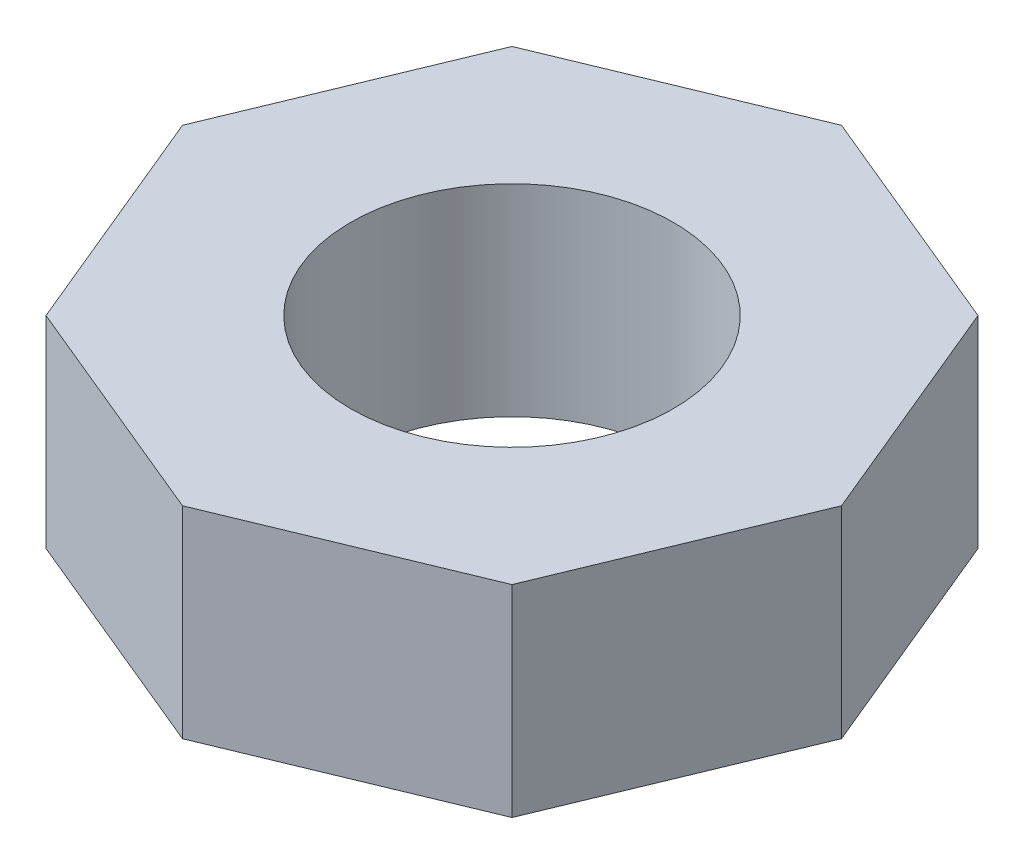
ISO-10303-21;
HEADER;
FILE_DESCRIPTION(('STEP AP214'),'2;1');
FILE_NAME('part.step','',(''),(''),'','','');
FILE_SCHEMA(('AUTOMOTIVE_DESIGN { 1 0 10303 214 1 1 1 1 }'));
ENDSEC;
DATA;
#1=APPLICATION_CONTEXT('core data for automotive mechanical design processes');
#2=APPLICATION_PROTOCOL_DEFINITION('international standard','automotive_design',2000,#1);
#3=PRODUCT_CONTEXT('',#1,'mechanical');
#4=PRODUCT('Part','Part','',(#3));
#5=PRODUCT_RELATED_PRODUCT_CATEGORY('part','',(#4));
#6=PRODUCT_DEFINITION_FORMATION('','',#4);
#7=PRODUCT_DEFINITION_CONTEXT('part definition',#1,'design');
#8=PRODUCT_DEFINITION('design','',#6,#7);
#9=PRODUCT_DEFINITION_SHAPE('','',#8);
#10=(LENGTH_UNIT() NAMED_UNIT(*) SI_UNIT(.MILLI.,.METRE.));
#11=(NAMED_UNIT(*) PLANE_ANGLE_UNIT() SI_UNIT($,.RADIAN.));
#12=(NAMED_UNIT(*) SI_UNIT($,.STERADIAN.) SOLID_ANGLE_UNIT());
#13=UNCERTAINTY_MEASURE_WITH_UNIT(LENGTH_MEASURE(1.E-05),#10,'distance_accuracy_value','');
#14=(GEOMETRIC_REPRESENTATION_CONTEXT(3) GLOBAL_UNCERTAINTY_ASSIGNED_CONTEXT((#13)) GLOBAL_UNIT_ASSIGNED_CONTEXT((#10,
#11,#12)) REPRESENTATION_CONTEXT('',''));
#15=CARTESIAN_POINT('',(0.,0.,0.));
#16=DIRECTION('',(0.,0.,1.));
#17=DIRECTION('',(1.,0.,0.));
#18=AXIS2_PLACEMENT_3D('',#15,#16,#17);
#19=CARTESIAN_POINT('',(0.,2.,0.));
#20=DIRECTION('',(0.,1.,0.));
#21=DIRECTION('',(0.,0.,1.));
#22=AXIS2_PLACEMENT_3D('',#19,#20,#21);
#23=PLANE('',#22);
#24=DIRECTION('',(0.382683432365078,0.,-0.923879532511292));
#25=VECTOR('',#24,1.);
#26=CARTESIAN_POINT('',(2.30969883127825,2.,2.30969883127819));
#27=LINE('',#26,#25);
#28=CARTESIAN_POINT('',(2.30969883127825,2.,2.30969883127819));
#29=VERTEX_POINT('',#28);
#30=CARTESIAN_POINT('',(3.26640741219094,2.,0.));
#31=VERTEX_POINT('',#30);
#32=EDGE_CURVE('E144',#29,#31,#27,.T.);
#33=ORIENTED_EDGE('',*,*,#32,.T.);
#34=DIRECTION('',(-0.382683432365102,0.,-0.923879532511282));
#35=VECTOR('',#34,1.);
#36=CARTESIAN_POINT('',(3.26640741219094,2.,0.));
#37=LINE('',#36,#35);
#38=CARTESIAN_POINT('',(2.30969883127819,2.,-2.30969883127825));
#39=VERTEX_POINT('',#38);
#40=EDGE_CURVE('E92',#31,#39,#37,.T.);
#41=ORIENTED_EDGE('',*,*,#40,.T.);
#42=DIRECTION('',(-0.923879532511292,0.,-0.382683432365078));
#43=VECTOR('',#42,1.);
#44=CARTESIAN_POINT('',(2.30969883127819,2.,-2.30969883127825));
#45=LINE('',#44,#43);
#46=CARTESIAN_POINT('',(0.,2.,-3.26640741219094));
#47=VERTEX_POINT('',#46);
#48=EDGE_CURVE('E159',#39,#47,#45,.T.);
#49=ORIENTED_EDGE('',*,*,#48,.T.);
#50=DIRECTION('',(-0.923879532511282,0.,0.382683432365102));
#51=VECTOR('',#50,1.);
#52=CARTESIAN_POINT('',(0.,2.,-3.26640741219094));
#53=LINE('',#52,#51);
#54=CARTESIAN_POINT('',(-2.30969883127825,2.,-2.30969883127819));
#55=VERTEX_POINT('',#54);
#56=EDGE_CURVE('E172',#47,#55,#53,.T.);
#57=ORIENTED_EDGE('',*,*,#56,.T.);
#58=DIRECTION('',(-0.382683432365078,0.,0.923879532511292));
#59=VECTOR('',#58,1.);
#60=CARTESIAN_POINT('',(-2.30969883127825,2.,-2.30969883127819));
#61=LINE('',#60,#59);
#62=CARTESIAN_POINT('',(-3.26640741219094,2.,0.));
#63=VERTEX_POINT('',#62);
#64=EDGE_CURVE('E111',#55,#63,#61,.T.);
#65=ORIENTED_EDGE('',*,*,#64,.T.);
#66=DIRECTION('',(0.382683432365102,0.,0.923879532511282));
#67=VECTOR('',#66,1.);
#68=CARTESIAN_POINT('',(-3.26640741219094,2.,0.));
#69=LINE('',#68,#67);
#70=CARTESIAN_POINT('',(-2.30969883127819,2.,2.30969883127825));
#71=VERTEX_POINT('',#70);
#72=EDGE_CURVE('E105',#63,#71,#69,.T.);
#73=ORIENTED_EDGE('',*,*,#72,.T.);
#74=DIRECTION('',(0.923879532511292,0.,0.382683432365078));
#75=VECTOR('',#74,1.);
#76=CARTESIAN_POINT('',(-2.30969883127819,2.,2.30969883127825));
#77=LINE('',#76,#75);
#78=CARTESIAN_POINT('',(0.,2.,3.26640741219094));
#79=VERTEX_POINT('',#78);
#80=EDGE_CURVE('E109',#71,#79,#77,.T.);
#81=ORIENTED_EDGE('',*,*,#80,.T.);
#82=DIRECTION('',(0.923879532511282,0.,-0.382683432365102));
#83=VECTOR('',#82,1.);
#84=CARTESIAN_POINT('',(0.,2.,3.26640741219094));
#85=LINE('',#84,#83);
#86=EDGE_CURVE('E49',#79,#29,#85,.T.);
#87=ORIENTED_EDGE('',*,*,#86,.T.);
#88=EDGE_LOOP('',(#33,#41,#49,#57,#65,#73,#81,#87));
#89=FACE_BOUND('',#88,.T.);
#90=CARTESIAN_POINT('',(0.,2.,0.));
#91=DIRECTION('',(0.,1.,0.));
#92=DIRECTION('',(0.,0.,1.));
#93=AXIS2_PLACEMENT_3D('',#90,#91,#92);
#94=CIRCLE('',#93,1.6);
#95=CARTESIAN_POINT('',(0.,2.,1.6));
#96=VERTEX_POINT('',#95);
#97=EDGE_CURVE('E133',#96,#96,#94,.T.);
#98=ORIENTED_EDGE('',*,*,#97,.F.);
#99=EDGE_LOOP('',(#98));
#100=FACE_BOUND('',#99,.T.);
#101=ADVANCED_FACE('F32',(#89,#100),#23,.T.);
#102=CARTESIAN_POINT('',(0.,0.,0.));
#103=DIRECTION('',(0.,1.,0.));
#104=DIRECTION('',(0.,0.,1.));
#105=AXIS2_PLACEMENT_3D('',#102,#103,#104);
#106=PLANE('',#105);
#107=DIRECTION('',(0.382683432365078,0.,-0.923879532511292));
#108=VECTOR('',#107,1.);
#109=CARTESIAN_POINT('',(2.30969883127825,0.,2.30969883127819));
#110=LINE('',#109,#108);
#111=CARTESIAN_POINT('',(2.30969883127825,0.,2.30969883127819));
#112=VERTEX_POINT('',#111);
#113=CARTESIAN_POINT('',(3.26640741219094,0.,0.));
#114=VERTEX_POINT('',#113);
#115=EDGE_CURVE('E129',#112,#114,#110,.T.);
#116=ORIENTED_EDGE('',*,*,#115,.F.);
#117=DIRECTION('',(0.923879532511282,0.,-0.382683432365102));
#118=VECTOR('',#117,1.);
#119=CARTESIAN_POINT('',(0.,0.,3.26640741219094));
#120=LINE('',#119,#118);
#121=CARTESIAN_POINT('',(0.,0.,3.26640741219094));
#122=VERTEX_POINT('',#121);
#123=EDGE_CURVE('E84',#122,#112,#120,.T.);
#124=ORIENTED_EDGE('',*,*,#123,.F.);
#125=DIRECTION('',(0.923879532511292,0.,0.382683432365078));
#126=VECTOR('',#125,1.);
#127=CARTESIAN_POINT('',(-2.30969883127819,0.,2.30969883127825));
#128=LINE('',#127,#126);
#129=CARTESIAN_POINT('',(-2.30969883127819,0.,2.30969883127825));
#130=VERTEX_POINT('',#129);
#131=EDGE_CURVE('E78',#130,#122,#128,.T.);
#132=ORIENTED_EDGE('',*,*,#131,.F.);
#133=DIRECTION('',(0.382683432365102,0.,0.923879532511282));
#134=VECTOR('',#133,1.);
#135=CARTESIAN_POINT('',(-3.26640741219094,0.,0.));
#136=LINE('',#135,#134);
#137=CARTESIAN_POINT('',(-3.26640741219094,0.,0.));
#138=VERTEX_POINT('',#137);
#139=EDGE_CURVE('E119',#138,#130,#136,.T.);
#140=ORIENTED_EDGE('',*,*,#139,.F.);
#141=DIRECTION('',(-0.382683432365078,0.,0.923879532511292));
#142=VECTOR('',#141,1.);
#143=CARTESIAN_POINT('',(-2.30969883127825,0.,-2.30969883127819));
#144=LINE('',#143,#142);
#145=CARTESIAN_POINT('',(-2.30969883127825,0.,-2.30969883127819));
#146=VERTEX_POINT('',#145);
#147=EDGE_CURVE('E139',#146,#138,#144,.T.);
#148=ORIENTED_EDGE('',*,*,#147,.F.);
#149=DIRECTION('',(-0.923879532511282,0.,0.382683432365102));
#150=VECTOR('',#149,1.);
#151=CARTESIAN_POINT('',(0.,0.,-3.26640741219094));
#152=LINE('',#151,#150);
#153=CARTESIAN_POINT('',(0.,0.,-3.26640741219094));
#154=VERTEX_POINT('',#153);
#155=EDGE_CURVE('E137',#154,#146,#152,.T.);
#156=ORIENTED_EDGE('',*,*,#155,.F.);
#157=DIRECTION('',(-0.923879532511292,0.,-0.382683432365078));
#158=VECTOR('',#157,1.);
#159=CARTESIAN_POINT('',(2.30969883127819,0.,-2.30969883127825));
#160=LINE('',#159,#158);
#161=CARTESIAN_POINT('',(2.30969883127819,0.,-2.30969883127825));
#162=VERTEX_POINT('',#161);
#163=EDGE_CURVE('E135',#162,#154,#160,.T.);
#164=ORIENTED_EDGE('',*,*,#163,.F.);
#165=DIRECTION('',(-0.382683432365102,0.,-0.923879532511282));
#166=VECTOR('',#165,1.);
#167=CARTESIAN_POINT('',(3.26640741219094,0.,0.));
#168=LINE('',#167,#166);
#169=EDGE_CURVE('E132',#114,#162,#168,.T.);
#170=ORIENTED_EDGE('',*,*,#169,.F.);
#171=EDGE_LOOP('',(#116,#124,#132,#140,#148,#156,#164,#170));
#172=FACE_BOUND('',#171,.T.);
#173=CARTESIAN_POINT('',(0.,0.,0.));
#174=DIRECTION('',(0.,1.,0.));
#175=DIRECTION('',(0.,0.,1.));
#176=AXIS2_PLACEMENT_3D('',#173,#174,#175);
#177=CIRCLE('',#176,1.6);
#178=CARTESIAN_POINT('',(0.,0.,1.6));
#179=VERTEX_POINT('',#178);
#180=EDGE_CURVE('E178',#179,#179,#177,.T.);
#181=ORIENTED_EDGE('',*,*,#180,.T.);
#182=EDGE_LOOP('',(#181));
#183=FACE_BOUND('',#182,.T.);
#184=ADVANCED_FACE('F163',(#172,#183),#106,.F.);
#185=CARTESIAN_POINT('',(2.30969883127825,2.,2.30969883127819));
#186=DIRECTION('',(-0.923879532511292,0.,-0.382683432365078));
#187=DIRECTION('',(-0.382683432365078,0.,0.923879532511292));
#188=AXIS2_PLACEMENT_3D('',#185,#186,#187);
#189=PLANE('',#188);
#190=ORIENTED_EDGE('',*,*,#115,.T.);
#191=DIRECTION('',(0.,-1.,0.));
#192=VECTOR('',#191,1.);
#193=CARTESIAN_POINT('',(3.26640741219094,2.,0.));
#194=LINE('',#193,#192);
#195=EDGE_CURVE('E11',#31,#114,#194,.T.);
#196=ORIENTED_EDGE('',*,*,#195,.F.);
#197=ORIENTED_EDGE('',*,*,#32,.F.);
#198=DIRECTION('',(0.,-1.,0.));
#199=VECTOR('',#198,1.);
#200=CARTESIAN_POINT('',(2.30969883127825,2.,2.30969883127819));
#201=LINE('',#200,#199);
#202=EDGE_CURVE('E125',#29,#112,#201,.T.);
#203=ORIENTED_EDGE('',*,*,#202,.T.);
#204=EDGE_LOOP('',(#190,#196,#197,#203));
#205=FACE_BOUND('',#204,.T.);
#206=ADVANCED_FACE('F34',(#205),#189,.F.);
#207=CARTESIAN_POINT('',(3.26640741219094,2.,0.));
#208=DIRECTION('',(-0.923879532511282,0.,0.382683432365102));
#209=DIRECTION('',(0.382683432365102,0.,0.923879532511282));
#210=AXIS2_PLACEMENT_3D('',#207,#208,#209);
#211=PLANE('',#210);
#212=ORIENTED_EDGE('',*,*,#169,.T.);
#213=DIRECTION('',(0.,-1.,0.));
#214=VECTOR('',#213,1.);
#215=CARTESIAN_POINT('',(2.30969883127819,2.,-2.30969883127825));
#216=LINE('',#215,#214);
#217=EDGE_CURVE('E41',#39,#162,#216,.T.);
#218=ORIENTED_EDGE('',*,*,#217,.F.);
#219=ORIENTED_EDGE('',*,*,#40,.F.);
#220=ORIENTED_EDGE('',*,*,#195,.T.);
#221=EDGE_LOOP('',(#212,#218,#219,#220));
#222=FACE_BOUND('',#221,.T.);
#223=ADVANCED_FACE('F206',(#222),#211,.F.);
#224=CARTESIAN_POINT('',(2.30969883127819,2.,-2.30969883127825));
#225=DIRECTION('',(-0.382683432365078,0.,0.923879532511292));
#226=DIRECTION('',(0.923879532511292,0.,0.382683432365078));
#227=AXIS2_PLACEMENT_3D('',#224,#225,#226);
#228=PLANE('',#227);
#229=ORIENTED_EDGE('',*,*,#163,.T.);
#230=DIRECTION('',(0.,-1.,0.));
#231=VECTOR('',#230,1.);
#232=CARTESIAN_POINT('',(0.,2.,-3.26640741219094));
#233=LINE('',#232,#231);
#234=EDGE_CURVE('E151',#47,#154,#233,.T.);
#235=ORIENTED_EDGE('',*,*,#234,.F.);
#236=ORIENTED_EDGE('',*,*,#48,.F.);
#237=ORIENTED_EDGE('',*,*,#217,.T.);
#238=EDGE_LOOP('',(#229,#235,#236,#237));
#239=FACE_BOUND('',#238,.T.);
#240=ADVANCED_FACE('F157',(#239),#228,.F.);
#241=CARTESIAN_POINT('',(0.,2.,-3.26640741219094));
#242=DIRECTION('',(0.382683432365102,0.,0.923879532511282));
#243=DIRECTION('',(0.923879532511282,0.,-0.382683432365102));
#244=AXIS2_PLACEMENT_3D('',#241,#242,#243);
#245=PLANE('',#244);
#246=ORIENTED_EDGE('',*,*,#155,.T.);
#247=DIRECTION('',(0.,-1.,0.));
#248=VECTOR('',#247,1.);
#249=CARTESIAN_POINT('',(-2.30969883127825,2.,-2.30969883127819));
#250=LINE('',#249,#248);
#251=EDGE_CURVE('E148',#55,#146,#250,.T.);
#252=ORIENTED_EDGE('',*,*,#251,.F.);
#253=ORIENTED_EDGE('',*,*,#56,.F.);
#254=ORIENTED_EDGE('',*,*,#234,.T.);
#255=EDGE_LOOP('',(#246,#252,#253,#254));
#256=FACE_BOUND('',#255,.T.);
#257=ADVANCED_FACE('F168',(#256),#245,.F.);
#258=CARTESIAN_POINT('',(-2.30969883127825,2.,-2.30969883127819));
#259=DIRECTION('',(0.923879532511292,0.,0.382683432365078));
#260=DIRECTION('',(0.382683432365078,0.,-0.923879532511292));
#261=AXIS2_PLACEMENT_3D('',#258,#259,#260);
#262=PLANE('',#261);
#263=ORIENTED_EDGE('',*,*,#147,.T.);
#264=DIRECTION('',(0.,-1.,0.));
#265=VECTOR('',#264,1.);
#266=CARTESIAN_POINT('',(-3.26640741219094,2.,0.));
#267=LINE('',#266,#265);
#268=EDGE_CURVE('E120',#63,#138,#267,.T.);
#269=ORIENTED_EDGE('',*,*,#268,.F.);
#270=ORIENTED_EDGE('',*,*,#64,.F.);
#271=ORIENTED_EDGE('',*,*,#251,.T.);
#272=EDGE_LOOP('',(#263,#269,#270,#271));
#273=FACE_BOUND('',#272,.T.);
#274=ADVANCED_FACE('F171',(#273),#262,.F.);
#275=CARTESIAN_POINT('',(-3.26640741219094,2.,0.));
#276=DIRECTION('',(0.923879532511282,0.,-0.382683432365102));
#277=DIRECTION('',(-0.382683432365102,0.,-0.923879532511282));
#278=AXIS2_PLACEMENT_3D('',#275,#276,#277);
#279=PLANE('',#278);
#280=ORIENTED_EDGE('',*,*,#139,.T.);
#281=DIRECTION('',(0.,-1.,0.));
#282=VECTOR('',#281,1.);
#283=CARTESIAN_POINT('',(-2.30969883127819,2.,2.30969883127825));
#284=LINE('',#283,#282);
#285=EDGE_CURVE('E116',#71,#130,#284,.T.);
#286=ORIENTED_EDGE('',*,*,#285,.F.);
#287=ORIENTED_EDGE('',*,*,#72,.F.);
#288=ORIENTED_EDGE('',*,*,#268,.T.);
#289=EDGE_LOOP('',(#280,#286,#287,#288));
#290=FACE_BOUND('',#289,.T.);
#291=ADVANCED_FACE('F117',(#290),#279,.F.);
#292=CARTESIAN_POINT('',(-2.30969883127819,2.,2.30969883127825));
#293=DIRECTION('',(0.382683432365078,0.,-0.923879532511292));
#294=DIRECTION('',(-0.923879532511292,0.,-0.382683432365078));
#295=AXIS2_PLACEMENT_3D('',#292,#293,#294);
#296=PLANE('',#295);
#297=ORIENTED_EDGE('',*,*,#131,.T.);
#298=DIRECTION('',(0.,-1.,0.));
#299=VECTOR('',#298,1.);
#300=CARTESIAN_POINT('',(0.,2.,3.26640741219094));
#301=LINE('',#300,#299);
#302=EDGE_CURVE('E121',#79,#122,#301,.T.);
#303=ORIENTED_EDGE('',*,*,#302,.F.);
#304=ORIENTED_EDGE('',*,*,#80,.F.);
#305=ORIENTED_EDGE('',*,*,#285,.T.);
#306=EDGE_LOOP('',(#297,#303,#304,#305));
#307=FACE_BOUND('',#306,.T.);
#308=ADVANCED_FACE('F123',(#307),#296,.F.);
#309=CARTESIAN_POINT('',(0.,2.,3.26640741219094));
#310=DIRECTION('',(-0.382683432365102,0.,-0.923879532511282));
#311=DIRECTION('',(-0.923879532511282,0.,0.382683432365102));
#312=AXIS2_PLACEMENT_3D('',#309,#310,#311);
#313=PLANE('',#312);
#314=ORIENTED_EDGE('',*,*,#123,.T.);
#315=ORIENTED_EDGE('',*,*,#202,.F.);
#316=ORIENTED_EDGE('',*,*,#86,.F.);
#317=ORIENTED_EDGE('',*,*,#302,.T.);
#318=EDGE_LOOP('',(#314,#315,#316,#317));
#319=FACE_BOUND('',#318,.T.);
#320=ADVANCED_FACE('F194',(#319),#313,.F.);
#321=CARTESIAN_POINT('',(0.,2.,0.));
#322=DIRECTION('',(0.,-1.,0.));
#323=DIRECTION('',(0.,0.,-1.));
#324=AXIS2_PLACEMENT_3D('',#321,#322,#323);
#325=CYLINDRICAL_SURFACE('',#324,1.6);
#326=ORIENTED_EDGE('',*,*,#97,.T.);
#327=EDGE_LOOP('',(#326));
#328=FACE_BOUND('',#327,.T.);
#329=ORIENTED_EDGE('',*,*,#180,.F.);
#330=EDGE_LOOP('',(#329));
#331=FACE_BOUND('',#330,.T.);
#332=ADVANCED_FACE('F184',(#328,#331),#325,.F.);
#333=CLOSED_SHELL('',(#101,#184,#206,#223,#240,#257,#274,#291,#308,#320,#332));
#334=MANIFOLD_SOLID_BREP('B2',#333);
#335=ADVANCED_BREP_SHAPE_REPRESENTATION('',(#18,#334),#14);
#336=SHAPE_DEFINITION_REPRESENTATION(#9,#335);
ENDSEC;
END-ISO-10303-21;
